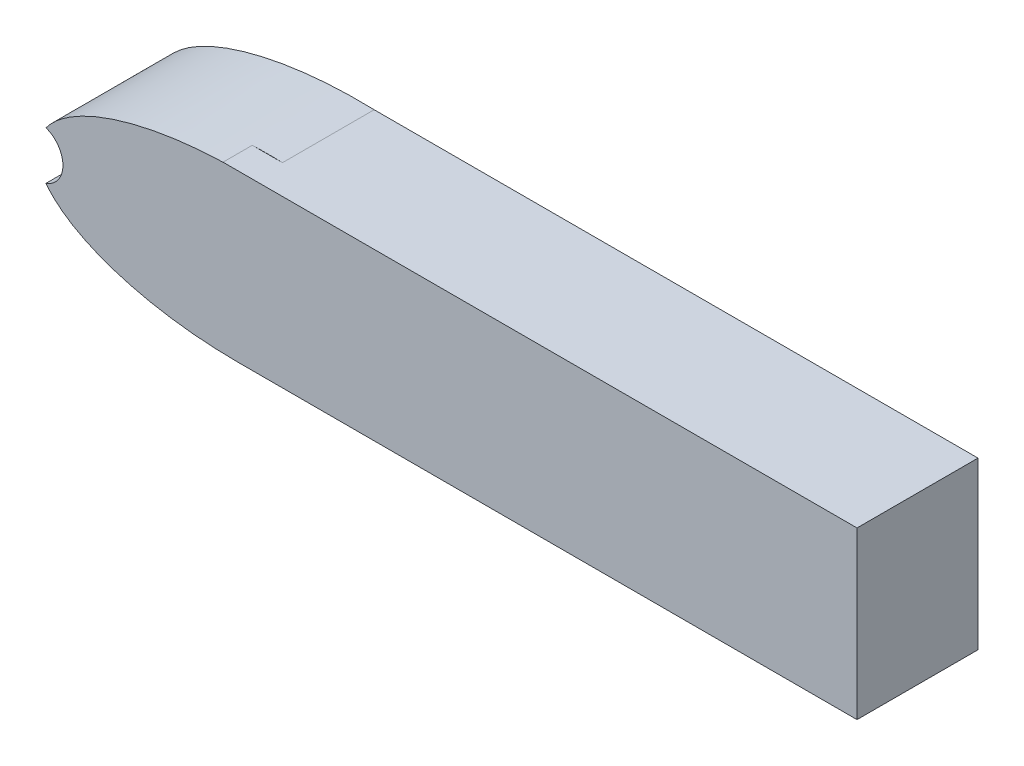
ISO-10303-21;
HEADER;
FILE_DESCRIPTION(('STEP AP214'),'2;1');
FILE_NAME('part.step','',(''),(''),'','','');
FILE_SCHEMA(('AUTOMOTIVE_DESIGN { 1 0 10303 214 1 1 1 1 }'));
ENDSEC;
DATA;
#1=APPLICATION_CONTEXT('core data for automotive mechanical design processes');
#2=APPLICATION_PROTOCOL_DEFINITION('international standard','automotive_design',2000,#1);
#3=PRODUCT_CONTEXT('',#1,'mechanical');
#4=PRODUCT('Part','Part','',(#3));
#5=PRODUCT_RELATED_PRODUCT_CATEGORY('part','',(#4));
#6=PRODUCT_DEFINITION_FORMATION('','',#4);
#7=PRODUCT_DEFINITION_CONTEXT('part definition',#1,'design');
#8=PRODUCT_DEFINITION('design','',#6,#7);
#9=PRODUCT_DEFINITION_SHAPE('','',#8);
#10=(LENGTH_UNIT() NAMED_UNIT(*) SI_UNIT(.MILLI.,.METRE.));
#11=(NAMED_UNIT(*) PLANE_ANGLE_UNIT() SI_UNIT($,.RADIAN.));
#12=(NAMED_UNIT(*) SI_UNIT($,.STERADIAN.) SOLID_ANGLE_UNIT());
#13=UNCERTAINTY_MEASURE_WITH_UNIT(LENGTH_MEASURE(1.E-05),#10,'distance_accuracy_value','');
#14=(GEOMETRIC_REPRESENTATION_CONTEXT(3) GLOBAL_UNCERTAINTY_ASSIGNED_CONTEXT((#13)) GLOBAL_UNIT_ASSIGNED_CONTEXT((#10,
#11,#12)) REPRESENTATION_CONTEXT('',''));
#15=CARTESIAN_POINT('',(0.,0.,0.));
#16=DIRECTION('',(0.,0.,1.));
#17=DIRECTION('',(1.,0.,0.));
#18=AXIS2_PLACEMENT_3D('',#15,#16,#17);
#19=CARTESIAN_POINT('',(-74.4429732300522,-2.31794478527607,18.288));
#20=DIRECTION('',(0.,0.,1.));
#21=DIRECTION('',(-1.,0.,0.));
#22=AXIS2_PLACEMENT_3D('',#19,#20,#21);
#23=ELLIPSE('',#22,40.0673312883436,16.5567484662577);
#24=DIRECTION('',(0.,0.,-1.));
#25=VECTOR('',#24,1.);
#26=SURFACE_OF_LINEAR_EXTRUSION('',#23,#25);
#27=CARTESIAN_POINT('',(-74.4429732300522,-2.31794478527607,24.13));
#28=DIRECTION('',(0.,0.,-1.));
#29=DIRECTION('',(-1.,0.,0.));
#30=AXIS2_PLACEMENT_3D('',#27,#28,#29);
#31=ELLIPSE('',#30,40.0673312883436,16.5567484662577);
#32=CARTESIAN_POINT('',(-74.4429732300522,-18.8746932515337,24.13));
#33=VERTEX_POINT('',#32);
#34=CARTESIAN_POINT('',(-112.795609683858,-7.10966424415431,24.13));
#35=VERTEX_POINT('',#34);
#36=EDGE_CURVE('E141',#33,#35,#31,.T.);
#37=ORIENTED_EDGE('',*,*,#36,.T.);
#38=DIRECTION('',(0.,0.,-1.));
#39=VECTOR('',#38,1.);
#40=CARTESIAN_POINT('',(-112.795609683858,-7.10966424415431,18.288));
#41=LINE('',#40,#39);
#42=CARTESIAN_POINT('',(-112.795609683858,-7.10966424415431,0.));
#43=VERTEX_POINT('',#42);
#44=EDGE_CURVE('E49',#35,#43,#41,.T.);
#45=ORIENTED_EDGE('',*,*,#44,.T.);
#46=CARTESIAN_POINT('',(-74.4429732300522,-2.31794478527607,0.));
#47=DIRECTION('',(0.,0.,1.));
#48=DIRECTION('',(-1.,0.,0.));
#49=AXIS2_PLACEMENT_3D('',#46,#47,#48);
#50=ELLIPSE('',#49,40.0673312883436,16.5567484662577);
#51=CARTESIAN_POINT('',(-74.4429732300522,-18.8746932515337,0.));
#52=VERTEX_POINT('',#51);
#53=EDGE_CURVE('E105',#43,#52,#50,.T.);
#54=ORIENTED_EDGE('',*,*,#53,.T.);
#55=DIRECTION('',(0.,0.,-1.));
#56=VECTOR('',#55,1.);
#57=CARTESIAN_POINT('',(-74.4429732300522,-18.8746932515337,24.13));
#58=LINE('',#57,#56);
#59=EDGE_CURVE('E113',#33,#52,#58,.T.);
#60=ORIENTED_EDGE('',*,*,#59,.F.);
#61=EDGE_LOOP('',(#37,#45,#54,#60));
#62=FACE_BOUND('',#61,.T.);
#63=ADVANCED_FACE('F33',(#62),#26,.F.);
#64=CARTESIAN_POINT('',(-71.468602430174,14.1931207458397,0.));
#65=VERTEX_POINT('',#64);
#66=CARTESIAN_POINT('',(-112.795609683858,2.47377467360217,0.));
#67=VERTEX_POINT('',#66);
#68=EDGE_CURVE('E102',#65,#67,#50,.T.);
#69=ORIENTED_EDGE('',*,*,#68,.T.);
#70=DIRECTION('',(0.,0.,-1.));
#71=VECTOR('',#70,1.);
#72=CARTESIAN_POINT('',(-112.795609683858,2.47377467360218,18.288));
#73=LINE('',#72,#71);
#74=CARTESIAN_POINT('',(-112.795609683858,2.47377467360217,24.13));
#75=VERTEX_POINT('',#74);
#76=EDGE_CURVE('E90',#67,#75,#73,.F.);
#77=ORIENTED_EDGE('',*,*,#76,.T.);
#78=CARTESIAN_POINT('',(-77.4906982647026,14.1908363725738,24.13));
#79=VERTEX_POINT('',#78);
#80=EDGE_CURVE('E127',#75,#79,#31,.T.);
#81=ORIENTED_EDGE('',*,*,#80,.T.);
#82=DIRECTION('',(0.,0.,-1.));
#83=VECTOR('',#82,1.);
#84=CARTESIAN_POINT('',(-77.4906982647026,14.1908363725738,24.13));
#85=LINE('',#84,#83);
#86=CARTESIAN_POINT('',(-77.4906982647026,14.1908363725738,18.288));
#87=VERTEX_POINT('',#86);
#88=EDGE_CURVE('E114',#79,#87,#85,.T.);
#89=ORIENTED_EDGE('',*,*,#88,.T.);
#90=CARTESIAN_POINT('',(-71.468602430174,14.1931207458397,18.288));
#91=VERTEX_POINT('',#90);
#92=EDGE_CURVE('E42',#91,#87,#23,.T.);
#93=ORIENTED_EDGE('',*,*,#92,.F.);
#94=DIRECTION('',(0.,0.,-1.));
#95=VECTOR('',#94,1.);
#96=CARTESIAN_POINT('',(-71.4686024301741,14.1931207458397,18.288));
#97=LINE('',#96,#95);
#98=EDGE_CURVE('E108',#91,#65,#97,.T.);
#99=ORIENTED_EDGE('',*,*,#98,.T.);
#100=EDGE_LOOP('',(#69,#77,#81,#89,#93,#99));
#101=FACE_BOUND('',#100,.T.);
#102=ADVANCED_FACE('F35',(#101),#26,.F.);
#103=CARTESIAN_POINT('',(-74.4429732300522,-2.31794478527607,18.288));
#104=DIRECTION('',(0.,0.,1.));
#105=DIRECTION('',(1.,0.,0.));
#106=AXIS2_PLACEMENT_3D('',#103,#104,#105);
#107=PLANE('',#106);
#108=DIRECTION('',(-0.999999928053649,-0.000379331907751566,0.));
#109=VECTOR('',#108,1.);
#110=CARTESIAN_POINT('',(-74.4492359755983,14.1919900963493,18.288));
#111=LINE('',#110,#109);
#112=EDGE_CURVE('E55',#91,#87,#111,.T.);
#113=ORIENTED_EDGE('',*,*,#112,.F.);
#114=ORIENTED_EDGE('',*,*,#92,.T.);
#115=EDGE_LOOP('',(#113,#114));
#116=FACE_BOUND('',#115,.T.);
#117=ADVANCED_FACE('F160',(#116),#107,.T.);
#118=CARTESIAN_POINT('',(-74.4429732300522,-2.31794478527607,0.));
#119=DIRECTION('',(0.,0.,1.));
#120=DIRECTION('',(1.,0.,0.));
#121=AXIS2_PLACEMENT_3D('',#118,#119,#120);
#122=PLANE('',#121);
#123=ORIENTED_EDGE('',*,*,#53,.F.);
#124=CARTESIAN_POINT('',(-114.510304518396,-2.31794478527607,0.));
#125=DIRECTION('',(0.,0.,-1.));
#126=DIRECTION('',(-1.,0.,0.));
#127=AXIS2_PLACEMENT_3D('',#124,#125,#126);
#128=CIRCLE('',#127,5.08927831309917);
#129=EDGE_CURVE('E93',#67,#43,#128,.T.);
#130=ORIENTED_EDGE('',*,*,#129,.F.);
#131=ORIENTED_EDGE('',*,*,#68,.F.);
#132=DIRECTION('',(0.999999928053649,0.000379331907751565,0.));
#133=VECTOR('',#132,1.);
#134=CARTESIAN_POINT('',(48.9613717471379,14.2388036809816,0.));
#135=LINE('',#134,#133);
#136=CARTESIAN_POINT('',(48.9613717471379,14.2388036809816,0.));
#137=VERTEX_POINT('',#136);
#138=EDGE_CURVE('E131',#65,#137,#135,.T.);
#139=ORIENTED_EDGE('',*,*,#138,.T.);
#140=DIRECTION('',(0.,-1.,0.));
#141=VECTOR('',#140,1.);
#142=CARTESIAN_POINT('',(48.9613717471379,-18.8746932515337,0.));
#143=LINE('',#142,#141);
#144=CARTESIAN_POINT('',(48.9613717471379,-18.8746932515337,0.));
#145=VERTEX_POINT('',#144);
#146=EDGE_CURVE('E128',#137,#145,#143,.T.);
#147=ORIENTED_EDGE('',*,*,#146,.T.);
#148=DIRECTION('',(-1.,0.,0.));
#149=VECTOR('',#148,1.);
#150=CARTESIAN_POINT('',(-74.4429732300522,-18.8746932515337,0.));
#151=LINE('',#150,#149);
#152=EDGE_CURVE('E125',#145,#52,#151,.T.);
#153=ORIENTED_EDGE('',*,*,#152,.T.);
#154=EDGE_LOOP('',(#123,#130,#131,#139,#147,#153));
#155=FACE_BOUND('',#154,.T.);
#156=ADVANCED_FACE('F101',(#155),#122,.F.);
#157=CARTESIAN_POINT('',(48.9613717471379,14.2388036809816,24.13));
#158=DIRECTION('',(-0.000379331907751565,0.999999928053649,0.));
#159=DIRECTION('',(-0.999999928053649,-0.000379331907751566,0.));
#160=AXIS2_PLACEMENT_3D('',#157,#158,#159);
#161=PLANE('',#160);
#162=ORIENTED_EDGE('',*,*,#98,.F.);
#163=ORIENTED_EDGE('',*,*,#112,.T.);
#164=ORIENTED_EDGE('',*,*,#88,.F.);
#165=DIRECTION('',(0.999999928053649,0.000379331907751565,0.));
#166=VECTOR('',#165,1.);
#167=CARTESIAN_POINT('',(48.9613717471379,14.2388036809816,24.13));
#168=LINE('',#167,#166);
#169=CARTESIAN_POINT('',(48.9613717471379,14.2388036809816,24.13));
#170=VERTEX_POINT('',#169);
#171=EDGE_CURVE('E138',#79,#170,#168,.T.);
#172=ORIENTED_EDGE('',*,*,#171,.T.);
#173=DIRECTION('',(0.,0.,-1.));
#174=VECTOR('',#173,1.);
#175=CARTESIAN_POINT('',(48.9613717471379,14.2388036809816,24.13));
#176=LINE('',#175,#174);
#177=EDGE_CURVE('E117',#170,#137,#176,.T.);
#178=ORIENTED_EDGE('',*,*,#177,.T.);
#179=ORIENTED_EDGE('',*,*,#138,.F.);
#180=EDGE_LOOP('',(#162,#163,#164,#172,#178,#179));
#181=FACE_BOUND('',#180,.T.);
#182=ADVANCED_FACE('F159',(#181),#161,.T.);
#183=CARTESIAN_POINT('',(-74.4429732300522,-18.8746932515337,24.13));
#184=DIRECTION('',(0.,-1.,0.));
#185=DIRECTION('',(0.,0.,-1.));
#186=AXIS2_PLACEMENT_3D('',#183,#184,#185);
#187=PLANE('',#186);
#188=ORIENTED_EDGE('',*,*,#152,.F.);
#189=DIRECTION('',(0.,0.,-1.));
#190=VECTOR('',#189,1.);
#191=CARTESIAN_POINT('',(48.9613717471379,-18.8746932515337,24.13));
#192=LINE('',#191,#190);
#193=CARTESIAN_POINT('',(48.9613717471379,-18.8746932515337,24.13));
#194=VERTEX_POINT('',#193);
#195=EDGE_CURVE('E121',#194,#145,#192,.T.);
#196=ORIENTED_EDGE('',*,*,#195,.F.);
#197=DIRECTION('',(-1.,0.,0.));
#198=VECTOR('',#197,1.);
#199=CARTESIAN_POINT('',(-74.4429732300522,-18.8746932515337,24.13));
#200=LINE('',#199,#198);
#201=EDGE_CURVE('E118',#194,#33,#200,.T.);
#202=ORIENTED_EDGE('',*,*,#201,.T.);
#203=ORIENTED_EDGE('',*,*,#59,.T.);
#204=EDGE_LOOP('',(#188,#196,#202,#203));
#205=FACE_BOUND('',#204,.T.);
#206=ADVANCED_FACE('F152',(#205),#187,.T.);
#207=CARTESIAN_POINT('',(48.9613717471379,-18.8746932515337,24.13));
#208=DIRECTION('',(1.,0.,0.));
#209=DIRECTION('',(0.,0.,-1.));
#210=AXIS2_PLACEMENT_3D('',#207,#208,#209);
#211=PLANE('',#210);
#212=ORIENTED_EDGE('',*,*,#146,.F.);
#213=ORIENTED_EDGE('',*,*,#177,.F.);
#214=DIRECTION('',(0.,-1.,0.));
#215=VECTOR('',#214,1.);
#216=CARTESIAN_POINT('',(48.9613717471379,-18.8746932515337,24.13));
#217=LINE('',#216,#215);
#218=EDGE_CURVE('E135',#170,#194,#217,.T.);
#219=ORIENTED_EDGE('',*,*,#218,.T.);
#220=ORIENTED_EDGE('',*,*,#195,.T.);
#221=EDGE_LOOP('',(#212,#213,#219,#220));
#222=FACE_BOUND('',#221,.T.);
#223=ADVANCED_FACE('F155',(#222),#211,.T.);
#224=CARTESIAN_POINT('',(-74.4429732300522,-2.31794478527607,24.13));
#225=DIRECTION('',(0.,0.,-1.));
#226=DIRECTION('',(-1.,0.,0.));
#227=AXIS2_PLACEMENT_3D('',#224,#225,#226);
#228=PLANE('',#227);
#229=ORIENTED_EDGE('',*,*,#80,.F.);
#230=CARTESIAN_POINT('',(-114.510304518396,-2.31794478527607,24.13));
#231=DIRECTION('',(0.,0.,-1.));
#232=DIRECTION('',(-1.,0.,0.));
#233=AXIS2_PLACEMENT_3D('',#230,#231,#232);
#234=CIRCLE('',#233,5.08927831309917);
#235=EDGE_CURVE('E11',#75,#35,#234,.T.);
#236=ORIENTED_EDGE('',*,*,#235,.T.);
#237=ORIENTED_EDGE('',*,*,#36,.F.);
#238=ORIENTED_EDGE('',*,*,#201,.F.);
#239=ORIENTED_EDGE('',*,*,#218,.F.);
#240=ORIENTED_EDGE('',*,*,#171,.F.);
#241=EDGE_LOOP('',(#229,#236,#237,#238,#239,#240));
#242=FACE_BOUND('',#241,.T.);
#243=ADVANCED_FACE('F148',(#242),#228,.F.);
#244=CARTESIAN_POINT('',(-114.510304518396,-2.31794478527607,49.784));
#245=DIRECTION('',(0.,0.,-1.));
#246=DIRECTION('',(-1.,0.,0.));
#247=AXIS2_PLACEMENT_3D('',#244,#245,#246);
#248=CYLINDRICAL_SURFACE('',#247,5.08927831309917);
#249=ORIENTED_EDGE('',*,*,#235,.F.);
#250=ORIENTED_EDGE('',*,*,#76,.F.);
#251=ORIENTED_EDGE('',*,*,#129,.T.);
#252=ORIENTED_EDGE('',*,*,#44,.F.);
#253=EDGE_LOOP('',(#249,#250,#251,#252));
#254=FACE_BOUND('',#253,.T.);
#255=ADVANCED_FACE('F92',(#254),#248,.F.);
#256=CLOSED_SHELL('',(#63,#102,#117,#156,#182,#206,#223,#243,#255));
#257=MANIFOLD_SOLID_BREP('B2',#256);
#258=ADVANCED_BREP_SHAPE_REPRESENTATION('',(#18,#257),#14);
#259=SHAPE_DEFINITION_REPRESENTATION(#9,#258);
ENDSEC;
END-ISO-10303-21;
